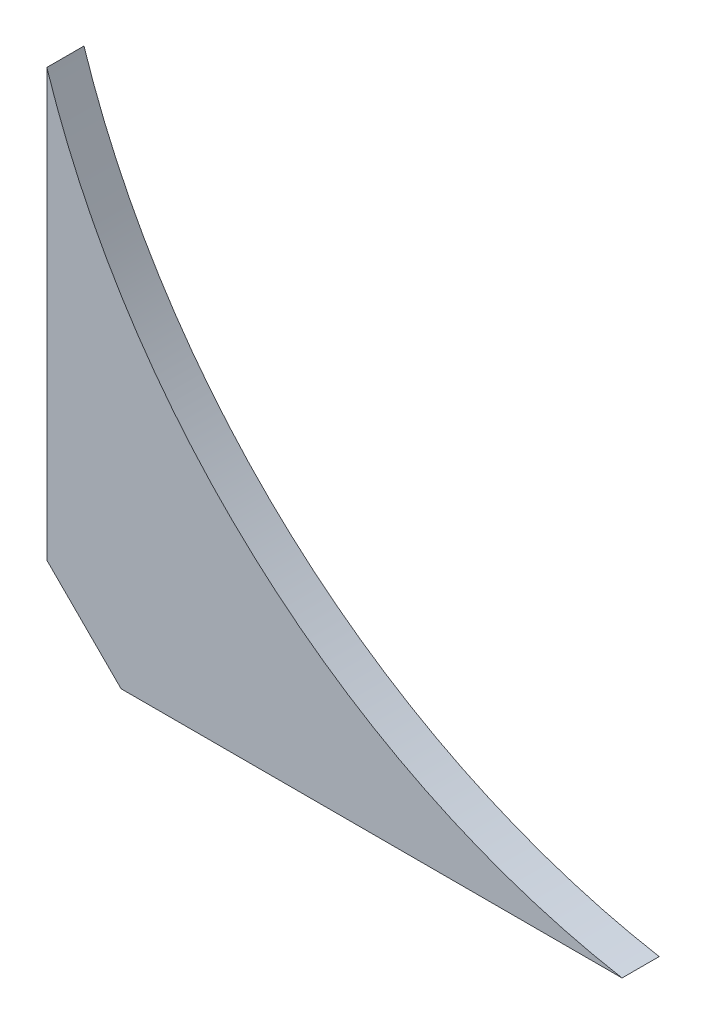
ISO-10303-21;
HEADER;
FILE_DESCRIPTION(('STEP AP214'),'2;1');
FILE_NAME('part.step','',(''),(''),'','','');
FILE_SCHEMA(('AUTOMOTIVE_DESIGN { 1 0 10303 214 1 1 1 1 }'));
ENDSEC;
DATA;
#1=APPLICATION_CONTEXT('core data for automotive mechanical design processes');
#2=APPLICATION_PROTOCOL_DEFINITION('international standard','automotive_design',2000,#1);
#3=PRODUCT_CONTEXT('',#1,'mechanical');
#4=PRODUCT('Part','Part','',(#3));
#5=PRODUCT_RELATED_PRODUCT_CATEGORY('part','',(#4));
#6=PRODUCT_DEFINITION_FORMATION('','',#4);
#7=PRODUCT_DEFINITION_CONTEXT('part definition',#1,'design');
#8=PRODUCT_DEFINITION('design','',#6,#7);
#9=PRODUCT_DEFINITION_SHAPE('','',#8);
#10=(LENGTH_UNIT() NAMED_UNIT(*) SI_UNIT(.MILLI.,.METRE.));
#11=(NAMED_UNIT(*) PLANE_ANGLE_UNIT() SI_UNIT($,.RADIAN.));
#12=(NAMED_UNIT(*) SI_UNIT($,.STERADIAN.) SOLID_ANGLE_UNIT());
#13=UNCERTAINTY_MEASURE_WITH_UNIT(LENGTH_MEASURE(1.E-05),#10,'distance_accuracy_value','');
#14=(GEOMETRIC_REPRESENTATION_CONTEXT(3) GLOBAL_UNCERTAINTY_ASSIGNED_CONTEXT((#13)) GLOBAL_UNIT_ASSIGNED_CONTEXT((#10,
#11,#12)) REPRESENTATION_CONTEXT('',''));
#15=CARTESIAN_POINT('',(0.,0.,0.));
#16=DIRECTION('',(0.,0.,1.));
#17=DIRECTION('',(1.,0.,0.));
#18=AXIS2_PLACEMENT_3D('',#15,#16,#17);
#19=CARTESIAN_POINT('',(140.022988713863,154.795518442698,5.));
#20=DIRECTION('',(0.,0.,-1.));
#21=DIRECTION('',(-1.,0.,0.));
#22=AXIS2_PLACEMENT_3D('',#19,#20,#21);
#23=CYLINDRICAL_SURFACE('',#22,200.);
#24=CARTESIAN_POINT('',(140.022988713863,154.795518442698,-5.));
#25=DIRECTION('',(0.,0.,-1.));
#26=DIRECTION('',(1.,0.,0.));
#27=AXIS2_PLACEMENT_3D('',#24,#25,#26);
#28=CIRCLE('',#27,200.);
#29=CARTESIAN_POINT('',(104.836752332385,-42.0849751804815,-5.));
#30=VERTEX_POINT('',#29);
#31=CARTESIAN_POINT('',(-50.1632476676154,92.9150248195185,-5.));
#32=VERTEX_POINT('',#31);
#33=EDGE_CURVE('E98',#30,#32,#28,.T.);
#34=ORIENTED_EDGE('',*,*,#33,.T.);
#35=DIRECTION('',(0.,0.,-1.));
#36=VECTOR('',#35,1.);
#37=CARTESIAN_POINT('',(-50.1632476676154,92.9150248195185,5.));
#38=LINE('',#37,#36);
#39=CARTESIAN_POINT('',(-50.1632476676154,92.9150248195185,5.));
#40=VERTEX_POINT('',#39);
#41=EDGE_CURVE('E11',#40,#32,#38,.T.);
#42=ORIENTED_EDGE('',*,*,#41,.F.);
#43=CARTESIAN_POINT('',(140.022988713863,154.795518442698,5.));
#44=DIRECTION('',(0.,0.,-1.));
#45=DIRECTION('',(1.,0.,0.));
#46=AXIS2_PLACEMENT_3D('',#43,#44,#45);
#47=CIRCLE('',#46,200.);
#48=CARTESIAN_POINT('',(104.836752332385,-42.0849751804815,5.));
#49=VERTEX_POINT('',#48);
#50=EDGE_CURVE('E86',#49,#40,#47,.T.);
#51=ORIENTED_EDGE('',*,*,#50,.F.);
#52=DIRECTION('',(0.,0.,-1.));
#53=VECTOR('',#52,1.);
#54=CARTESIAN_POINT('',(104.836752332385,-42.0849751804815,5.));
#55=LINE('',#54,#53);
#56=EDGE_CURVE('E94',#49,#30,#55,.T.);
#57=ORIENTED_EDGE('',*,*,#56,.T.);
#58=EDGE_LOOP('',(#34,#42,#51,#57));
#59=FACE_BOUND('',#58,.T.);
#60=ADVANCED_FACE('F35',(#59),#23,.F.);
#61=CARTESIAN_POINT('',(-50.1632476676154,92.9150248195185,5.));
#62=DIRECTION('',(1.,0.,0.));
#63=DIRECTION('',(0.,1.,0.));
#64=AXIS2_PLACEMENT_3D('',#61,#62,#63);
#65=PLANE('',#64);
#66=DIRECTION('',(0.,-1.,0.));
#67=VECTOR('',#66,1.);
#68=CARTESIAN_POINT('',(-50.1632476676154,92.9150248195185,-5.));
#69=LINE('',#68,#67);
#70=CARTESIAN_POINT('',(-50.1632476676153,-22.0849751804815,-5.));
#71=VERTEX_POINT('',#70);
#72=EDGE_CURVE('E90',#32,#71,#69,.T.);
#73=ORIENTED_EDGE('',*,*,#72,.T.);
#74=DIRECTION('',(0.,0.,-1.));
#75=VECTOR('',#74,1.);
#76=CARTESIAN_POINT('',(-50.1632476676153,-22.0849751804815,5.));
#77=LINE('',#76,#75);
#78=CARTESIAN_POINT('',(-50.1632476676153,-22.0849751804815,5.));
#79=VERTEX_POINT('',#78);
#80=EDGE_CURVE('E43',#79,#71,#77,.T.);
#81=ORIENTED_EDGE('',*,*,#80,.F.);
#82=DIRECTION('',(0.,-1.,0.));
#83=VECTOR('',#82,1.);
#84=CARTESIAN_POINT('',(-50.1632476676154,92.9150248195185,5.));
#85=LINE('',#84,#83);
#86=EDGE_CURVE('E81',#40,#79,#85,.T.);
#87=ORIENTED_EDGE('',*,*,#86,.F.);
#88=ORIENTED_EDGE('',*,*,#41,.T.);
#89=EDGE_LOOP('',(#73,#81,#87,#88));
#90=FACE_BOUND('',#89,.T.);
#91=ADVANCED_FACE('F89',(#90),#65,.F.);
#92=CARTESIAN_POINT('',(-50.1632476676153,-22.0849751804815,5.));
#93=DIRECTION('',(0.707106781186548,0.707106781186548,0.));
#94=DIRECTION('',(-0.707106781186548,0.707106781186548,0.));
#95=AXIS2_PLACEMENT_3D('',#92,#93,#94);
#96=PLANE('',#95);
#97=DIRECTION('',(0.707106781186548,-0.707106781186548,0.));
#98=VECTOR('',#97,1.);
#99=CARTESIAN_POINT('',(-50.1632476676153,-22.0849751804815,-5.));
#100=LINE('',#99,#98);
#101=CARTESIAN_POINT('',(-30.1632476676153,-42.0849751804815,-5.));
#102=VERTEX_POINT('',#101);
#103=EDGE_CURVE('E68',#71,#102,#100,.T.);
#104=ORIENTED_EDGE('',*,*,#103,.T.);
#105=DIRECTION('',(0.,0.,-1.));
#106=VECTOR('',#105,1.);
#107=CARTESIAN_POINT('',(-30.1632476676153,-42.0849751804815,5.));
#108=LINE('',#107,#106);
#109=CARTESIAN_POINT('',(-30.1632476676153,-42.0849751804815,5.));
#110=VERTEX_POINT('',#109);
#111=EDGE_CURVE('E91',#110,#102,#108,.T.);
#112=ORIENTED_EDGE('',*,*,#111,.F.);
#113=DIRECTION('',(0.707106781186548,-0.707106781186548,0.));
#114=VECTOR('',#113,1.);
#115=CARTESIAN_POINT('',(-50.1632476676153,-22.0849751804815,5.));
#116=LINE('',#115,#114);
#117=EDGE_CURVE('E84',#79,#110,#116,.T.);
#118=ORIENTED_EDGE('',*,*,#117,.F.);
#119=ORIENTED_EDGE('',*,*,#80,.T.);
#120=EDGE_LOOP('',(#104,#112,#118,#119));
#121=FACE_BOUND('',#120,.T.);
#122=ADVANCED_FACE('F92',(#121),#96,.F.);
#123=CARTESIAN_POINT('',(-30.1632476676153,-42.0849751804815,5.));
#124=DIRECTION('',(0.,1.,0.));
#125=DIRECTION('',(0.,0.,1.));
#126=AXIS2_PLACEMENT_3D('',#123,#124,#125);
#127=PLANE('',#126);
#128=DIRECTION('',(1.,0.,0.));
#129=VECTOR('',#128,1.);
#130=CARTESIAN_POINT('',(-30.1632476676153,-42.0849751804815,-5.));
#131=LINE('',#130,#129);
#132=EDGE_CURVE('E74',#102,#30,#131,.T.);
#133=ORIENTED_EDGE('',*,*,#132,.T.);
#134=ORIENTED_EDGE('',*,*,#56,.F.);
#135=DIRECTION('',(1.,0.,0.));
#136=VECTOR('',#135,1.);
#137=CARTESIAN_POINT('',(-30.1632476676153,-42.0849751804815,5.));
#138=LINE('',#137,#136);
#139=EDGE_CURVE('E51',#110,#49,#138,.T.);
#140=ORIENTED_EDGE('',*,*,#139,.F.);
#141=ORIENTED_EDGE('',*,*,#111,.T.);
#142=EDGE_LOOP('',(#133,#134,#140,#141));
#143=FACE_BOUND('',#142,.T.);
#144=ADVANCED_FACE('F105',(#143),#127,.F.);
#145=CARTESIAN_POINT('',(140.022988713863,154.795518442698,5.));
#146=DIRECTION('',(0.,0.,1.));
#147=DIRECTION('',(1.,0.,0.));
#148=AXIS2_PLACEMENT_3D('',#145,#146,#147);
#149=PLANE('',#148);
#150=ORIENTED_EDGE('',*,*,#50,.T.);
#151=ORIENTED_EDGE('',*,*,#86,.T.);
#152=ORIENTED_EDGE('',*,*,#117,.T.);
#153=ORIENTED_EDGE('',*,*,#139,.T.);
#154=EDGE_LOOP('',(#150,#151,#152,#153));
#155=FACE_BOUND('',#154,.T.);
#156=ADVANCED_FACE('F82',(#155),#149,.T.);
#157=CARTESIAN_POINT('',(140.022988713863,154.795518442698,-5.));
#158=DIRECTION('',(0.,0.,1.));
#159=DIRECTION('',(1.,0.,0.));
#160=AXIS2_PLACEMENT_3D('',#157,#158,#159);
#161=PLANE('',#160);
#162=ORIENTED_EDGE('',*,*,#33,.F.);
#163=ORIENTED_EDGE('',*,*,#132,.F.);
#164=ORIENTED_EDGE('',*,*,#103,.F.);
#165=ORIENTED_EDGE('',*,*,#72,.F.);
#166=EDGE_LOOP('',(#162,#163,#164,#165));
#167=FACE_BOUND('',#166,.T.);
#168=ADVANCED_FACE('F108',(#167),#161,.F.);
#169=CLOSED_SHELL('',(#60,#91,#122,#144,#156,#168));
#170=MANIFOLD_SOLID_BREP('B2',#169);
#171=ADVANCED_BREP_SHAPE_REPRESENTATION('',(#18,#170),#14);
#172=SHAPE_DEFINITION_REPRESENTATION(#9,#171);
ENDSEC;
END-ISO-10303-21;
